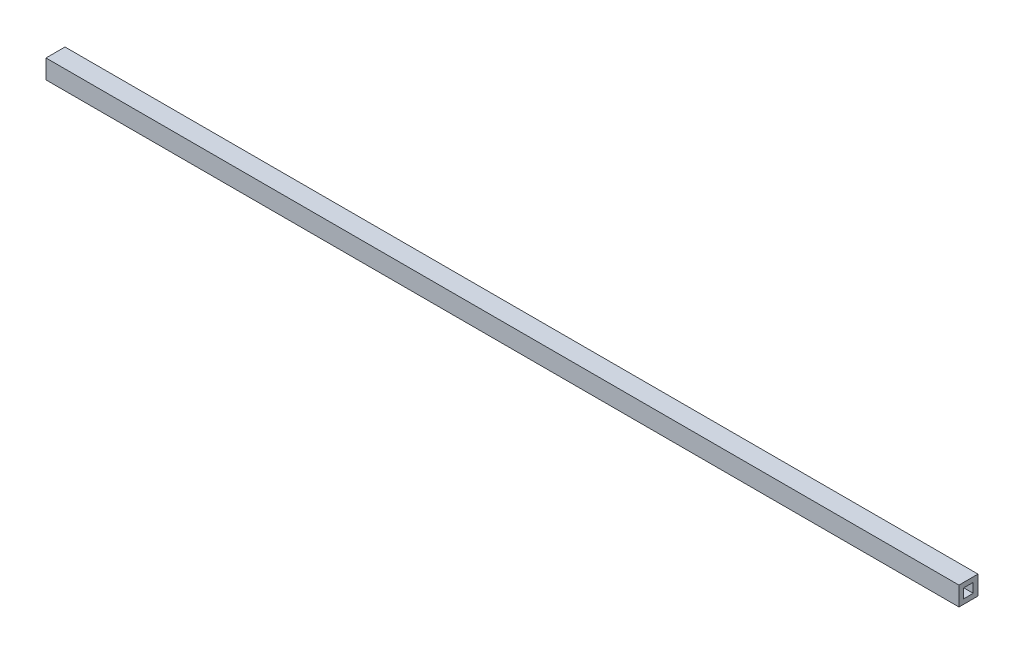
ISO-10303-21;
HEADER;
FILE_DESCRIPTION(('STEP AP214'),'2;1');
FILE_NAME('part.step','',(''),(''),'','','');
FILE_SCHEMA(('AUTOMOTIVE_DESIGN { 1 0 10303 214 1 1 1 1 }'));
ENDSEC;
DATA;
#1=APPLICATION_CONTEXT('core data for automotive mechanical design processes');
#2=APPLICATION_PROTOCOL_DEFINITION('international standard','automotive_design',2000,#1);
#3=PRODUCT_CONTEXT('',#1,'mechanical');
#4=PRODUCT('Part','Part','',(#3));
#5=PRODUCT_RELATED_PRODUCT_CATEGORY('part','',(#4));
#6=PRODUCT_DEFINITION_FORMATION('','',#4);
#7=PRODUCT_DEFINITION_CONTEXT('part definition',#1,'design');
#8=PRODUCT_DEFINITION('design','',#6,#7);
#9=PRODUCT_DEFINITION_SHAPE('','',#8);
#10=(LENGTH_UNIT() NAMED_UNIT(*) SI_UNIT(.MILLI.,.METRE.));
#11=(NAMED_UNIT(*) PLANE_ANGLE_UNIT() SI_UNIT($,.RADIAN.));
#12=(NAMED_UNIT(*) SI_UNIT($,.STERADIAN.) SOLID_ANGLE_UNIT());
#13=UNCERTAINTY_MEASURE_WITH_UNIT(LENGTH_MEASURE(1.E-05),#10,'distance_accuracy_value','');
#14=(GEOMETRIC_REPRESENTATION_CONTEXT(3) GLOBAL_UNCERTAINTY_ASSIGNED_CONTEXT((#13)) GLOBAL_UNIT_ASSIGNED_CONTEXT((#10,
#11,#12)) REPRESENTATION_CONTEXT('',''));
#15=CARTESIAN_POINT('',(0.,0.,0.));
#16=DIRECTION('',(0.,0.,1.));
#17=DIRECTION('',(1.,0.,0.));
#18=AXIS2_PLACEMENT_3D('',#15,#16,#17);
#19=CARTESIAN_POINT('',(-609.6,-12.7000000000001,25.4));
#20=DIRECTION('',(1.,0.,0.));
#21=DIRECTION('',(0.,0.,-1.));
#22=AXIS2_PLACEMENT_3D('',#19,#20,#21);
#23=PLANE('',#22);
#24=DIRECTION('',(0.,0.,1.));
#25=VECTOR('',#24,1.);
#26=CARTESIAN_POINT('',(-609.6,6.35,6.35));
#27=LINE('',#26,#25);
#28=CARTESIAN_POINT('',(-609.6,6.35,6.35));
#29=VERTEX_POINT('',#28);
#30=CARTESIAN_POINT('',(-609.6,6.34999999999999,19.05));
#31=VERTEX_POINT('',#30);
#32=EDGE_CURVE('E105',#29,#31,#27,.T.);
#33=ORIENTED_EDGE('',*,*,#32,.T.);
#34=DIRECTION('',(0.,-1.,0.));
#35=VECTOR('',#34,1.);
#36=CARTESIAN_POINT('',(-609.6,6.34999999999999,19.05));
#37=LINE('',#36,#35);
#38=CARTESIAN_POINT('',(-609.6,-6.35,19.05));
#39=VERTEX_POINT('',#38);
#40=EDGE_CURVE('E99',#31,#39,#37,.T.);
#41=ORIENTED_EDGE('',*,*,#40,.T.);
#42=DIRECTION('',(0.,0.,-1.));
#43=VECTOR('',#42,1.);
#44=CARTESIAN_POINT('',(-609.6,-6.35,6.35));
#45=LINE('',#44,#43);
#46=CARTESIAN_POINT('',(-609.6,-6.35,6.35));
#47=VERTEX_POINT('',#46);
#48=EDGE_CURVE('E108',#39,#47,#45,.T.);
#49=ORIENTED_EDGE('',*,*,#48,.T.);
#50=DIRECTION('',(0.,1.,0.));
#51=VECTOR('',#50,1.);
#52=CARTESIAN_POINT('',(-609.6,6.35,6.35));
#53=LINE('',#52,#51);
#54=EDGE_CURVE('E47',#47,#29,#53,.T.);
#55=ORIENTED_EDGE('',*,*,#54,.T.);
#56=EDGE_LOOP('',(#33,#41,#49,#55));
#57=FACE_BOUND('',#56,.T.);
#58=DIRECTION('',(0.,-1.,0.));
#59=VECTOR('',#58,1.);
#60=CARTESIAN_POINT('',(-609.6,-12.7000000000001,0.));
#61=LINE('',#60,#59);
#62=CARTESIAN_POINT('',(-609.6,12.6999999999999,0.));
#63=VERTEX_POINT('',#62);
#64=CARTESIAN_POINT('',(-609.6,-12.7000000000001,0.));
#65=VERTEX_POINT('',#64);
#66=EDGE_CURVE('E129',#63,#65,#61,.T.);
#67=ORIENTED_EDGE('',*,*,#66,.T.);
#68=DIRECTION('',(0.,0.,-1.));
#69=VECTOR('',#68,1.);
#70=CARTESIAN_POINT('',(-609.6,-12.7000000000001,25.4));
#71=LINE('',#70,#69);
#72=CARTESIAN_POINT('',(-609.6,-12.7000000000001,25.4));
#73=VERTEX_POINT('',#72);
#74=EDGE_CURVE('E11',#73,#65,#71,.T.);
#75=ORIENTED_EDGE('',*,*,#74,.F.);
#76=DIRECTION('',(0.,-1.,0.));
#77=VECTOR('',#76,1.);
#78=CARTESIAN_POINT('',(-609.6,-12.7000000000001,25.4));
#79=LINE('',#78,#77);
#80=CARTESIAN_POINT('',(-609.6,12.6999999999999,25.4));
#81=VERTEX_POINT('',#80);
#82=EDGE_CURVE('E133',#81,#73,#79,.T.);
#83=ORIENTED_EDGE('',*,*,#82,.F.);
#84=DIRECTION('',(0.,0.,-1.));
#85=VECTOR('',#84,1.);
#86=CARTESIAN_POINT('',(-609.6,12.6999999999999,25.4));
#87=LINE('',#86,#85);
#88=EDGE_CURVE('E143',#81,#63,#87,.T.);
#89=ORIENTED_EDGE('',*,*,#88,.T.);
#90=EDGE_LOOP('',(#67,#75,#83,#89));
#91=FACE_BOUND('',#90,.T.);
#92=ADVANCED_FACE('F33',(#57,#91),#23,.F.);
#93=CARTESIAN_POINT('',(609.6,-12.6999999999999,25.4));
#94=DIRECTION('',(0.,1.,0.));
#95=DIRECTION('',(-1.,0.,0.));
#96=AXIS2_PLACEMENT_3D('',#93,#94,#95);
#97=PLANE('',#96);
#98=DIRECTION('',(1.,0.,0.));
#99=VECTOR('',#98,1.);
#100=CARTESIAN_POINT('',(609.6,-12.6999999999999,0.));
#101=LINE('',#100,#99);
#102=CARTESIAN_POINT('',(609.6,-12.6999999999999,0.));
#103=VERTEX_POINT('',#102);
#104=EDGE_CURVE('E146',#65,#103,#101,.T.);
#105=ORIENTED_EDGE('',*,*,#104,.T.);
#106=DIRECTION('',(0.,0.,-1.));
#107=VECTOR('',#106,1.);
#108=CARTESIAN_POINT('',(609.6,-12.6999999999999,25.4));
#109=LINE('',#108,#107);
#110=CARTESIAN_POINT('',(609.6,-12.6999999999999,25.4));
#111=VERTEX_POINT('',#110);
#112=EDGE_CURVE('E40',#111,#103,#109,.T.);
#113=ORIENTED_EDGE('',*,*,#112,.F.);
#114=DIRECTION('',(1.,0.,0.));
#115=VECTOR('',#114,1.);
#116=CARTESIAN_POINT('',(609.6,-12.6999999999999,25.4));
#117=LINE('',#116,#115);
#118=EDGE_CURVE('E136',#73,#111,#117,.T.);
#119=ORIENTED_EDGE('',*,*,#118,.F.);
#120=ORIENTED_EDGE('',*,*,#74,.T.);
#121=EDGE_LOOP('',(#105,#113,#119,#120));
#122=FACE_BOUND('',#121,.T.);
#123=ADVANCED_FACE('F175',(#122),#97,.F.);
#124=CARTESIAN_POINT('',(609.6,-12.6999999999999,25.4));
#125=DIRECTION('',(-1.,0.,0.));
#126=DIRECTION('',(0.,0.,1.));
#127=AXIS2_PLACEMENT_3D('',#124,#125,#126);
#128=PLANE('',#127);
#129=DIRECTION('',(0.,0.,-1.));
#130=VECTOR('',#129,1.);
#131=CARTESIAN_POINT('',(609.6,-6.35,6.35));
#132=LINE('',#131,#130);
#133=CARTESIAN_POINT('',(609.6,-6.35,19.05));
#134=VERTEX_POINT('',#133);
#135=CARTESIAN_POINT('',(609.6,-6.35,6.35));
#136=VERTEX_POINT('',#135);
#137=EDGE_CURVE('E123',#134,#136,#132,.T.);
#138=ORIENTED_EDGE('',*,*,#137,.F.);
#139=DIRECTION('',(0.,-1.,0.));
#140=VECTOR('',#139,1.);
#141=CARTESIAN_POINT('',(609.6,6.34999999999999,19.05));
#142=LINE('',#141,#140);
#143=CARTESIAN_POINT('',(609.6,6.34999999999999,19.05));
#144=VERTEX_POINT('',#143);
#145=EDGE_CURVE('E55',#144,#134,#142,.T.);
#146=ORIENTED_EDGE('',*,*,#145,.F.);
#147=DIRECTION('',(0.,0.,1.));
#148=VECTOR('',#147,1.);
#149=CARTESIAN_POINT('',(609.6,6.35,6.35));
#150=LINE('',#149,#148);
#151=CARTESIAN_POINT('',(609.6,6.35,6.35));
#152=VERTEX_POINT('',#151);
#153=EDGE_CURVE('E114',#152,#144,#150,.T.);
#154=ORIENTED_EDGE('',*,*,#153,.F.);
#155=DIRECTION('',(0.,1.,0.));
#156=VECTOR('',#155,1.);
#157=CARTESIAN_POINT('',(609.6,6.35,6.35));
#158=LINE('',#157,#156);
#159=EDGE_CURVE('E117',#136,#152,#158,.T.);
#160=ORIENTED_EDGE('',*,*,#159,.F.);
#161=EDGE_LOOP('',(#138,#146,#154,#160));
#162=FACE_BOUND('',#161,.T.);
#163=DIRECTION('',(0.,1.,0.));
#164=VECTOR('',#163,1.);
#165=CARTESIAN_POINT('',(609.6,-12.6999999999999,0.));
#166=LINE('',#165,#164);
#167=CARTESIAN_POINT('',(609.6,12.7000000000001,0.));
#168=VERTEX_POINT('',#167);
#169=EDGE_CURVE('E148',#103,#168,#166,.T.);
#170=ORIENTED_EDGE('',*,*,#169,.T.);
#171=DIRECTION('',(0.,0.,-1.));
#172=VECTOR('',#171,1.);
#173=CARTESIAN_POINT('',(609.6,12.7000000000001,25.4));
#174=LINE('',#173,#172);
#175=CARTESIAN_POINT('',(609.6,12.7000000000001,25.4));
#176=VERTEX_POINT('',#175);
#177=EDGE_CURVE('E153',#176,#168,#174,.T.);
#178=ORIENTED_EDGE('',*,*,#177,.F.);
#179=DIRECTION('',(0.,1.,0.));
#180=VECTOR('',#179,1.);
#181=CARTESIAN_POINT('',(609.6,-12.6999999999999,25.4));
#182=LINE('',#181,#180);
#183=EDGE_CURVE('E139',#111,#176,#182,.T.);
#184=ORIENTED_EDGE('',*,*,#183,.F.);
#185=ORIENTED_EDGE('',*,*,#112,.T.);
#186=EDGE_LOOP('',(#170,#178,#184,#185));
#187=FACE_BOUND('',#186,.T.);
#188=ADVANCED_FACE('F160',(#162,#187),#128,.F.);
#189=CARTESIAN_POINT('',(609.6,12.7000000000001,25.4));
#190=DIRECTION('',(0.,-1.,0.));
#191=DIRECTION('',(1.,0.,0.));
#192=AXIS2_PLACEMENT_3D('',#189,#190,#191);
#193=PLANE('',#192);
#194=DIRECTION('',(-1.,0.,0.));
#195=VECTOR('',#194,1.);
#196=CARTESIAN_POINT('',(609.6,12.7000000000001,0.));
#197=LINE('',#196,#195);
#198=EDGE_CURVE('E137',#168,#63,#197,.T.);
#199=ORIENTED_EDGE('',*,*,#198,.T.);
#200=ORIENTED_EDGE('',*,*,#88,.F.);
#201=DIRECTION('',(-1.,0.,0.));
#202=VECTOR('',#201,1.);
#203=CARTESIAN_POINT('',(609.6,12.7000000000001,25.4));
#204=LINE('',#203,#202);
#205=EDGE_CURVE('E141',#176,#81,#204,.T.);
#206=ORIENTED_EDGE('',*,*,#205,.F.);
#207=ORIENTED_EDGE('',*,*,#177,.T.);
#208=EDGE_LOOP('',(#199,#200,#206,#207));
#209=FACE_BOUND('',#208,.T.);
#210=ADVANCED_FACE('F169',(#209),#193,.F.);
#211=CARTESIAN_POINT('',(0.,0.,25.4));
#212=DIRECTION('',(0.,0.,1.));
#213=DIRECTION('',(1.,0.,0.));
#214=AXIS2_PLACEMENT_3D('',#211,#212,#213);
#215=PLANE('',#214);
#216=ORIENTED_EDGE('',*,*,#82,.T.);
#217=ORIENTED_EDGE('',*,*,#118,.T.);
#218=ORIENTED_EDGE('',*,*,#183,.T.);
#219=ORIENTED_EDGE('',*,*,#205,.T.);
#220=EDGE_LOOP('',(#216,#217,#218,#219));
#221=FACE_BOUND('',#220,.T.);
#222=ADVANCED_FACE('F174',(#221),#215,.T.);
#223=CARTESIAN_POINT('',(0.,0.,0.));
#224=DIRECTION('',(0.,0.,1.));
#225=DIRECTION('',(1.,0.,0.));
#226=AXIS2_PLACEMENT_3D('',#223,#224,#225);
#227=PLANE('',#226);
#228=ORIENTED_EDGE('',*,*,#66,.F.);
#229=ORIENTED_EDGE('',*,*,#198,.F.);
#230=ORIENTED_EDGE('',*,*,#169,.F.);
#231=ORIENTED_EDGE('',*,*,#104,.F.);
#232=EDGE_LOOP('',(#228,#229,#230,#231));
#233=FACE_BOUND('',#232,.T.);
#234=ADVANCED_FACE('F166',(#233),#227,.F.);
#235=CARTESIAN_POINT('',(-609.6,6.34999999999999,19.05));
#236=DIRECTION('',(0.,0.,1.));
#237=DIRECTION('',(1.,0.,0.));
#238=AXIS2_PLACEMENT_3D('',#235,#236,#237);
#239=PLANE('',#238);
#240=ORIENTED_EDGE('',*,*,#145,.T.);
#241=DIRECTION('',(1.,0.,0.));
#242=VECTOR('',#241,1.);
#243=CARTESIAN_POINT('',(-609.6,-6.35,19.05));
#244=LINE('',#243,#242);
#245=EDGE_CURVE('E95',#39,#134,#244,.T.);
#246=ORIENTED_EDGE('',*,*,#245,.F.);
#247=ORIENTED_EDGE('',*,*,#40,.F.);
#248=DIRECTION('',(1.,0.,0.));
#249=VECTOR('',#248,1.);
#250=CARTESIAN_POINT('',(-609.6,6.34999999999999,19.05));
#251=LINE('',#250,#249);
#252=EDGE_CURVE('E127',#31,#144,#251,.T.);
#253=ORIENTED_EDGE('',*,*,#252,.T.);
#254=EDGE_LOOP('',(#240,#246,#247,#253));
#255=FACE_BOUND('',#254,.T.);
#256=ADVANCED_FACE('F97',(#255),#239,.F.);
#257=CARTESIAN_POINT('',(-609.6,6.35,6.35));
#258=DIRECTION('',(0.,1.,0.));
#259=DIRECTION('',(0.,0.,1.));
#260=AXIS2_PLACEMENT_3D('',#257,#258,#259);
#261=PLANE('',#260);
#262=ORIENTED_EDGE('',*,*,#153,.T.);
#263=ORIENTED_EDGE('',*,*,#252,.F.);
#264=ORIENTED_EDGE('',*,*,#32,.F.);
#265=DIRECTION('',(1.,0.,0.));
#266=VECTOR('',#265,1.);
#267=CARTESIAN_POINT('',(-609.6,6.35,6.35));
#268=LINE('',#267,#266);
#269=EDGE_CURVE('E130',#29,#152,#268,.T.);
#270=ORIENTED_EDGE('',*,*,#269,.T.);
#271=EDGE_LOOP('',(#262,#263,#264,#270));
#272=FACE_BOUND('',#271,.T.);
#273=ADVANCED_FACE('F192',(#272),#261,.F.);
#274=CARTESIAN_POINT('',(-609.6,6.35,6.35));
#275=DIRECTION('',(0.,0.,-1.));
#276=DIRECTION('',(0.,1.,0.));
#277=AXIS2_PLACEMENT_3D('',#274,#275,#276);
#278=PLANE('',#277);
#279=ORIENTED_EDGE('',*,*,#159,.T.);
#280=ORIENTED_EDGE('',*,*,#269,.F.);
#281=ORIENTED_EDGE('',*,*,#54,.F.);
#282=DIRECTION('',(1.,0.,0.));
#283=VECTOR('',#282,1.);
#284=CARTESIAN_POINT('',(-609.6,-6.35,6.35));
#285=LINE('',#284,#283);
#286=EDGE_CURVE('E104',#47,#136,#285,.T.);
#287=ORIENTED_EDGE('',*,*,#286,.T.);
#288=EDGE_LOOP('',(#279,#280,#281,#287));
#289=FACE_BOUND('',#288,.T.);
#290=ADVANCED_FACE('F195',(#289),#278,.F.);
#291=CARTESIAN_POINT('',(-609.6,-6.35,6.35));
#292=DIRECTION('',(0.,-1.,0.));
#293=DIRECTION('',(0.,0.,-1.));
#294=AXIS2_PLACEMENT_3D('',#291,#292,#293);
#295=PLANE('',#294);
#296=ORIENTED_EDGE('',*,*,#137,.T.);
#297=ORIENTED_EDGE('',*,*,#286,.F.);
#298=ORIENTED_EDGE('',*,*,#48,.F.);
#299=ORIENTED_EDGE('',*,*,#245,.T.);
#300=EDGE_LOOP('',(#296,#297,#298,#299));
#301=FACE_BOUND('',#300,.T.);
#302=ADVANCED_FACE('F109',(#301),#295,.F.);
#303=CLOSED_SHELL('',(#92,#123,#188,#210,#222,#234,#256,#273,#290,#302));
#304=MANIFOLD_SOLID_BREP('B2',#303);
#305=ADVANCED_BREP_SHAPE_REPRESENTATION('',(#18,#304),#14);
#306=SHAPE_DEFINITION_REPRESENTATION(#9,#305);
ENDSEC;
END-ISO-10303-21;
